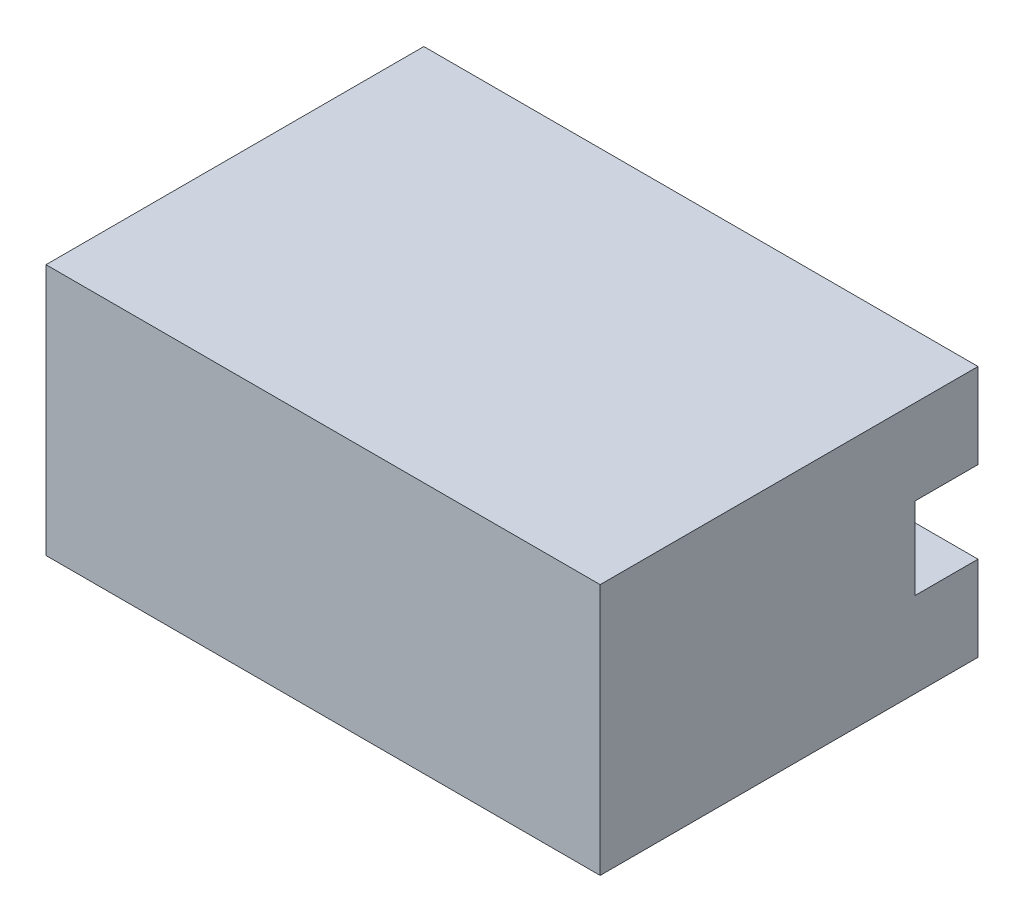
ISO-10303-21;
HEADER;
FILE_DESCRIPTION(('STEP AP214'),'2;1');
FILE_NAME('part.step','',(''),(''),'','','');
FILE_SCHEMA(('AUTOMOTIVE_DESIGN { 1 0 10303 214 1 1 1 1 }'));
ENDSEC;
DATA;
#1=APPLICATION_CONTEXT('core data for automotive mechanical design processes');
#2=APPLICATION_PROTOCOL_DEFINITION('international standard','automotive_design',2000,#1);
#3=PRODUCT_CONTEXT('',#1,'mechanical');
#4=PRODUCT('Part','Part','',(#3));
#5=PRODUCT_RELATED_PRODUCT_CATEGORY('part','',(#4));
#6=PRODUCT_DEFINITION_FORMATION('','',#4);
#7=PRODUCT_DEFINITION_CONTEXT('part definition',#1,'design');
#8=PRODUCT_DEFINITION('design','',#6,#7);
#9=PRODUCT_DEFINITION_SHAPE('','',#8);
#10=(LENGTH_UNIT() NAMED_UNIT(*) SI_UNIT(.MILLI.,.METRE.));
#11=(NAMED_UNIT(*) PLANE_ANGLE_UNIT() SI_UNIT($,.RADIAN.));
#12=(NAMED_UNIT(*) SI_UNIT($,.STERADIAN.) SOLID_ANGLE_UNIT());
#13=UNCERTAINTY_MEASURE_WITH_UNIT(LENGTH_MEASURE(1.E-05),#10,'distance_accuracy_value','');
#14=(GEOMETRIC_REPRESENTATION_CONTEXT(3) GLOBAL_UNCERTAINTY_ASSIGNED_CONTEXT((#13)) GLOBAL_UNIT_ASSIGNED_CONTEXT((#10,
#11,#12)) REPRESENTATION_CONTEXT('',''));
#15=CARTESIAN_POINT('',(0.,0.,0.));
#16=DIRECTION('',(0.,0.,1.));
#17=DIRECTION('',(1.,0.,0.));
#18=AXIS2_PLACEMENT_3D('',#15,#16,#17);
#19=CARTESIAN_POINT('',(-15.,5.,6.5));
#20=DIRECTION('',(1.,0.,0.));
#21=DIRECTION('',(0.,0.,-1.));
#22=AXIS2_PLACEMENT_3D('',#19,#20,#21);
#23=PLANE('',#22);
#24=DIRECTION('',(0.,1.,0.));
#25=VECTOR('',#24,1.);
#26=CARTESIAN_POINT('',(-15.,-1.62499999999999,-6.));
#27=LINE('',#26,#25);
#28=CARTESIAN_POINT('',(-15.,-1.62499999999999,-6.));
#29=VERTEX_POINT('',#28);
#30=CARTESIAN_POINT('',(-15.,1.62499999999999,-6.));
#31=VERTEX_POINT('',#30);
#32=EDGE_CURVE('E139',#29,#31,#27,.T.);
#33=ORIENTED_EDGE('',*,*,#32,.F.);
#34=DIRECTION('',(0.,0.,-1.));
#35=VECTOR('',#34,1.);
#36=CARTESIAN_POINT('',(-15.,-1.62499999999999,-6.));
#37=LINE('',#36,#35);
#38=CARTESIAN_POINT('',(-15.,-1.62499999999999,-8.5));
#39=VERTEX_POINT('',#38);
#40=EDGE_CURVE('E148',#29,#39,#37,.T.);
#41=ORIENTED_EDGE('',*,*,#40,.T.);
#42=DIRECTION('',(0.,-1.,0.));
#43=VECTOR('',#42,1.);
#44=CARTESIAN_POINT('',(-15.,-5.,-8.5));
#45=LINE('',#44,#43);
#46=CARTESIAN_POINT('',(-15.,-5.,-8.5));
#47=VERTEX_POINT('',#46);
#48=EDGE_CURVE('E122',#39,#47,#45,.T.);
#49=ORIENTED_EDGE('',*,*,#48,.T.);
#50=DIRECTION('',(0.,0.,-1.));
#51=VECTOR('',#50,1.);
#52=CARTESIAN_POINT('',(-15.,-5.,6.5));
#53=LINE('',#52,#51);
#54=CARTESIAN_POINT('',(-15.,-5.,6.5));
#55=VERTEX_POINT('',#54);
#56=EDGE_CURVE('E11',#55,#47,#53,.T.);
#57=ORIENTED_EDGE('',*,*,#56,.F.);
#58=DIRECTION('',(0.,-1.,0.));
#59=VECTOR('',#58,1.);
#60=CARTESIAN_POINT('',(-15.,5.,6.5));
#61=LINE('',#60,#59);
#62=CARTESIAN_POINT('',(-15.,5.,6.5));
#63=VERTEX_POINT('',#62);
#64=EDGE_CURVE('E109',#63,#55,#61,.T.);
#65=ORIENTED_EDGE('',*,*,#64,.F.);
#66=DIRECTION('',(0.,0.,-1.));
#67=VECTOR('',#66,1.);
#68=CARTESIAN_POINT('',(-15.,5.,6.5));
#69=LINE('',#68,#67);
#70=CARTESIAN_POINT('',(-15.,5.,-8.5));
#71=VERTEX_POINT('',#70);
#72=EDGE_CURVE('E41',#63,#71,#69,.T.);
#73=ORIENTED_EDGE('',*,*,#72,.T.);
#74=DIRECTION('',(0.,1.,0.));
#75=VECTOR('',#74,1.);
#76=CARTESIAN_POINT('',(-15.,5.,-8.5));
#77=LINE('',#76,#75);
#78=CARTESIAN_POINT('',(-15.,1.62499999999999,-8.5));
#79=VERTEX_POINT('',#78);
#80=EDGE_CURVE('E133',#79,#71,#77,.T.);
#81=ORIENTED_EDGE('',*,*,#80,.F.);
#82=DIRECTION('',(0.,0.,-1.));
#83=VECTOR('',#82,1.);
#84=CARTESIAN_POINT('',(-15.,1.62499999999999,-6.));
#85=LINE('',#84,#83);
#86=EDGE_CURVE('E147',#31,#79,#85,.T.);
#87=ORIENTED_EDGE('',*,*,#86,.F.);
#88=EDGE_LOOP('',(#33,#41,#49,#57,#65,#73,#81,#87));
#89=FACE_BOUND('',#88,.T.);
#90=ADVANCED_FACE('F34',(#89),#23,.F.);
#91=CARTESIAN_POINT('',(-15.,-5.,6.5));
#92=DIRECTION('',(0.,1.,0.));
#93=DIRECTION('',(0.,0.,1.));
#94=AXIS2_PLACEMENT_3D('',#91,#92,#93);
#95=PLANE('',#94);
#96=ORIENTED_EDGE('',*,*,#56,.T.);
#97=DIRECTION('',(1.,0.,0.));
#98=VECTOR('',#97,1.);
#99=CARTESIAN_POINT('',(7.,-5.,-8.5));
#100=LINE('',#99,#98);
#101=CARTESIAN_POINT('',(7.,-5.,-8.5));
#102=VERTEX_POINT('',#101);
#103=EDGE_CURVE('E115',#47,#102,#100,.T.);
#104=ORIENTED_EDGE('',*,*,#103,.T.);
#105=DIRECTION('',(0.,0.,-1.));
#106=VECTOR('',#105,1.);
#107=CARTESIAN_POINT('',(7.,-5.,6.5));
#108=LINE('',#107,#106);
#109=CARTESIAN_POINT('',(7.,-5.,6.5));
#110=VERTEX_POINT('',#109);
#111=EDGE_CURVE('E99',#110,#102,#108,.T.);
#112=ORIENTED_EDGE('',*,*,#111,.F.);
#113=DIRECTION('',(1.,0.,0.));
#114=VECTOR('',#113,1.);
#115=CARTESIAN_POINT('',(-15.,-5.,6.5));
#116=LINE('',#115,#114);
#117=EDGE_CURVE('E159',#55,#110,#116,.T.);
#118=ORIENTED_EDGE('',*,*,#117,.F.);
#119=EDGE_LOOP('',(#96,#104,#112,#118));
#120=FACE_BOUND('',#119,.T.);
#121=ADVANCED_FACE('F120',(#120),#95,.F.);
#122=CARTESIAN_POINT('',(-15.,5.,6.5));
#123=DIRECTION('',(0.,-1.,0.));
#124=DIRECTION('',(0.,0.,-1.));
#125=AXIS2_PLACEMENT_3D('',#122,#123,#124);
#126=PLANE('',#125);
#127=DIRECTION('',(-1.,0.,0.));
#128=VECTOR('',#127,1.);
#129=CARTESIAN_POINT('',(-15.,5.,6.5));
#130=LINE('',#129,#128);
#131=CARTESIAN_POINT('',(7.,5.,6.5));
#132=VERTEX_POINT('',#131);
#133=EDGE_CURVE('E56',#132,#63,#130,.T.);
#134=ORIENTED_EDGE('',*,*,#133,.F.);
#135=DIRECTION('',(0.,0.,1.));
#136=VECTOR('',#135,1.);
#137=CARTESIAN_POINT('',(7.,5.,6.5));
#138=LINE('',#137,#136);
#139=CARTESIAN_POINT('',(7.,5.,-8.5));
#140=VERTEX_POINT('',#139);
#141=EDGE_CURVE('E150',#140,#132,#138,.T.);
#142=ORIENTED_EDGE('',*,*,#141,.F.);
#143=DIRECTION('',(1.,0.,0.));
#144=VECTOR('',#143,1.);
#145=CARTESIAN_POINT('',(7.,5.,-8.5));
#146=LINE('',#145,#144);
#147=EDGE_CURVE('E136',#71,#140,#146,.T.);
#148=ORIENTED_EDGE('',*,*,#147,.F.);
#149=ORIENTED_EDGE('',*,*,#72,.F.);
#150=EDGE_LOOP('',(#134,#142,#148,#149));
#151=FACE_BOUND('',#150,.T.);
#152=ADVANCED_FACE('F172',(#151),#126,.F.);
#153=CARTESIAN_POINT('',(0.,0.,6.5));
#154=DIRECTION('',(0.,0.,1.));
#155=DIRECTION('',(1.,0.,0.));
#156=AXIS2_PLACEMENT_3D('',#153,#154,#155);
#157=PLANE('',#156);
#158=ORIENTED_EDGE('',*,*,#117,.T.);
#159=DIRECTION('',(0.,-1.,0.));
#160=VECTOR('',#159,1.);
#161=CARTESIAN_POINT('',(7.,-5.,6.5));
#162=LINE('',#161,#160);
#163=EDGE_CURVE('E106',#132,#110,#162,.T.);
#164=ORIENTED_EDGE('',*,*,#163,.F.);
#165=ORIENTED_EDGE('',*,*,#133,.T.);
#166=ORIENTED_EDGE('',*,*,#64,.T.);
#167=EDGE_LOOP('',(#158,#164,#165,#166));
#168=FACE_BOUND('',#167,.T.);
#169=ADVANCED_FACE('F173',(#168),#157,.T.);
#170=CARTESIAN_POINT('',(7.,0.,0.));
#171=DIRECTION('',(-1.,0.,0.));
#172=DIRECTION('',(0.,0.,1.));
#173=AXIS2_PLACEMENT_3D('',#170,#171,#172);
#174=PLANE('',#173);
#175=ORIENTED_EDGE('',*,*,#111,.T.);
#176=DIRECTION('',(0.,1.,0.));
#177=VECTOR('',#176,1.);
#178=CARTESIAN_POINT('',(7.,-5.,-8.5));
#179=LINE('',#178,#177);
#180=CARTESIAN_POINT('',(7.,-1.625,-8.5));
#181=VERTEX_POINT('',#180);
#182=EDGE_CURVE('E103',#102,#181,#179,.T.);
#183=ORIENTED_EDGE('',*,*,#182,.T.);
#184=DIRECTION('',(0.,0.,-1.));
#185=VECTOR('',#184,1.);
#186=CARTESIAN_POINT('',(7.00000000000001,-1.625,-6.));
#187=LINE('',#186,#185);
#188=CARTESIAN_POINT('',(7.00000000000001,-1.625,-6.));
#189=VERTEX_POINT('',#188);
#190=EDGE_CURVE('E151',#189,#181,#187,.T.);
#191=ORIENTED_EDGE('',*,*,#190,.F.);
#192=DIRECTION('',(0.,-1.,0.));
#193=VECTOR('',#192,1.);
#194=CARTESIAN_POINT('',(7.00000000000001,-1.625,-6.));
#195=LINE('',#194,#193);
#196=CARTESIAN_POINT('',(7.,1.625,-6.));
#197=VERTEX_POINT('',#196);
#198=EDGE_CURVE('E142',#197,#189,#195,.T.);
#199=ORIENTED_EDGE('',*,*,#198,.F.);
#200=DIRECTION('',(0.,0.,-1.));
#201=VECTOR('',#200,1.);
#202=CARTESIAN_POINT('',(7.,1.625,-6.));
#203=LINE('',#202,#201);
#204=CARTESIAN_POINT('',(7.,1.625,-8.5));
#205=VERTEX_POINT('',#204);
#206=EDGE_CURVE('E153',#197,#205,#203,.T.);
#207=ORIENTED_EDGE('',*,*,#206,.T.);
#208=DIRECTION('',(0.,-1.,0.));
#209=VECTOR('',#208,1.);
#210=CARTESIAN_POINT('',(7.,5.,-8.5));
#211=LINE('',#210,#209);
#212=EDGE_CURVE('E127',#140,#205,#211,.T.);
#213=ORIENTED_EDGE('',*,*,#212,.F.);
#214=ORIENTED_EDGE('',*,*,#141,.T.);
#215=ORIENTED_EDGE('',*,*,#163,.T.);
#216=EDGE_LOOP('',(#175,#183,#191,#199,#207,#213,#214,#215));
#217=FACE_BOUND('',#216,.T.);
#218=ADVANCED_FACE('F101',(#217),#174,.F.);
#219=CARTESIAN_POINT('',(7.00000000000001,-1.625,-6.));
#220=DIRECTION('',(0.,-1.,0.));
#221=DIRECTION('',(1.,0.,0.));
#222=AXIS2_PLACEMENT_3D('',#219,#220,#221);
#223=PLANE('',#222);
#224=ORIENTED_EDGE('',*,*,#190,.T.);
#225=DIRECTION('',(-1.,0.,0.));
#226=VECTOR('',#225,1.);
#227=CARTESIAN_POINT('',(7.,-1.625,-8.5));
#228=LINE('',#227,#226);
#229=EDGE_CURVE('E118',#181,#39,#228,.T.);
#230=ORIENTED_EDGE('',*,*,#229,.T.);
#231=ORIENTED_EDGE('',*,*,#40,.F.);
#232=DIRECTION('',(-1.,0.,0.));
#233=VECTOR('',#232,1.);
#234=CARTESIAN_POINT('',(7.00000000000001,-1.625,-6.));
#235=LINE('',#234,#233);
#236=EDGE_CURVE('E144',#189,#29,#235,.T.);
#237=ORIENTED_EDGE('',*,*,#236,.F.);
#238=EDGE_LOOP('',(#224,#230,#231,#237));
#239=FACE_BOUND('',#238,.T.);
#240=ADVANCED_FACE('F175',(#239),#223,.F.);
#241=CARTESIAN_POINT('',(7.,1.625,-6.));
#242=DIRECTION('',(0.,1.,0.));
#243=DIRECTION('',(-1.,0.,0.));
#244=AXIS2_PLACEMENT_3D('',#241,#242,#243);
#245=PLANE('',#244);
#246=ORIENTED_EDGE('',*,*,#86,.T.);
#247=DIRECTION('',(-1.,0.,0.));
#248=VECTOR('',#247,1.);
#249=CARTESIAN_POINT('',(7.,1.625,-8.5));
#250=LINE('',#249,#248);
#251=EDGE_CURVE('E130',#205,#79,#250,.T.);
#252=ORIENTED_EDGE('',*,*,#251,.F.);
#253=ORIENTED_EDGE('',*,*,#206,.F.);
#254=DIRECTION('',(1.,0.,0.));
#255=VECTOR('',#254,1.);
#256=CARTESIAN_POINT('',(7.,1.625,-6.));
#257=LINE('',#256,#255);
#258=EDGE_CURVE('E48',#31,#197,#257,.T.);
#259=ORIENTED_EDGE('',*,*,#258,.F.);
#260=EDGE_LOOP('',(#246,#252,#253,#259));
#261=FACE_BOUND('',#260,.T.);
#262=ADVANCED_FACE('F180',(#261),#245,.F.);
#263=CARTESIAN_POINT('',(0.,0.,-6.));
#264=DIRECTION('',(0.,0.,1.));
#265=DIRECTION('',(1.,0.,0.));
#266=AXIS2_PLACEMENT_3D('',#263,#264,#265);
#267=PLANE('',#266);
#268=ORIENTED_EDGE('',*,*,#32,.T.);
#269=ORIENTED_EDGE('',*,*,#258,.T.);
#270=ORIENTED_EDGE('',*,*,#198,.T.);
#271=ORIENTED_EDGE('',*,*,#236,.T.);
#272=EDGE_LOOP('',(#268,#269,#270,#271));
#273=FACE_BOUND('',#272,.T.);
#274=ADVANCED_FACE('F178',(#273),#267,.F.);
#275=CARTESIAN_POINT('',(0.,0.,-8.5));
#276=DIRECTION('',(0.,0.,-1.));
#277=DIRECTION('',(-1.,0.,0.));
#278=AXIS2_PLACEMENT_3D('',#275,#276,#277);
#279=PLANE('',#278);
#280=ORIENTED_EDGE('',*,*,#212,.T.);
#281=ORIENTED_EDGE('',*,*,#251,.T.);
#282=ORIENTED_EDGE('',*,*,#80,.T.);
#283=ORIENTED_EDGE('',*,*,#147,.T.);
#284=EDGE_LOOP('',(#280,#281,#282,#283));
#285=FACE_BOUND('',#284,.T.);
#286=ADVANCED_FACE('F169',(#285),#279,.T.);
#287=CARTESIAN_POINT('',(0.,0.,-8.5));
#288=DIRECTION('',(0.,0.,-1.));
#289=DIRECTION('',(-1.,0.,0.));
#290=AXIS2_PLACEMENT_3D('',#287,#288,#289);
#291=PLANE('',#290);
#292=ORIENTED_EDGE('',*,*,#182,.F.);
#293=ORIENTED_EDGE('',*,*,#103,.F.);
#294=ORIENTED_EDGE('',*,*,#48,.F.);
#295=ORIENTED_EDGE('',*,*,#229,.F.);
#296=EDGE_LOOP('',(#292,#293,#294,#295));
#297=FACE_BOUND('',#296,.T.);
#298=ADVANCED_FACE('F113',(#297),#291,.T.);
#299=CLOSED_SHELL('',(#90,#121,#152,#169,#218,#240,#262,#274,#286,#298));
#300=MANIFOLD_SOLID_BREP('B2',#299);
#301=ADVANCED_BREP_SHAPE_REPRESENTATION('',(#18,#300),#14);
#302=SHAPE_DEFINITION_REPRESENTATION(#9,#301);
ENDSEC;
END-ISO-10303-21;
